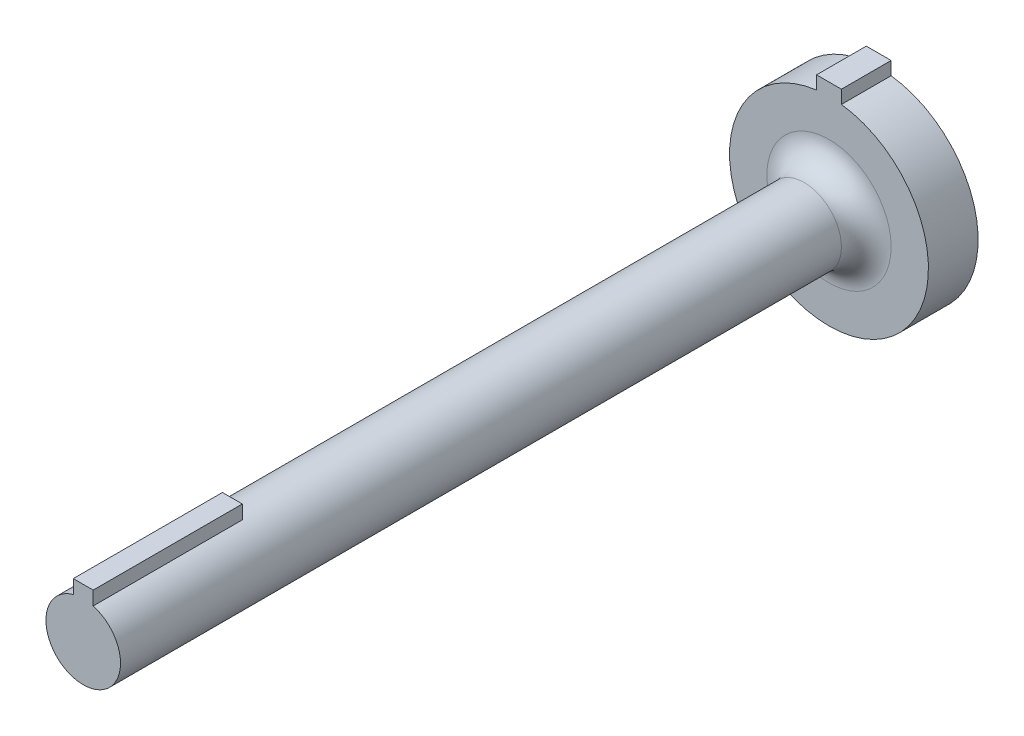
ISO-10303-21;
HEADER;
FILE_DESCRIPTION(('STEP AP214'),'2;1');
FILE_NAME('part.step','',(''),(''),'','','');
FILE_SCHEMA(('AUTOMOTIVE_DESIGN { 1 0 10303 214 1 1 1 1 }'));
ENDSEC;
DATA;
#1=APPLICATION_CONTEXT('core data for automotive mechanical design processes');
#2=APPLICATION_PROTOCOL_DEFINITION('international standard','automotive_design',2000,#1);
#3=PRODUCT_CONTEXT('',#1,'mechanical');
#4=PRODUCT('Part','Part','',(#3));
#5=PRODUCT_RELATED_PRODUCT_CATEGORY('part','',(#4));
#6=PRODUCT_DEFINITION_FORMATION('','',#4);
#7=PRODUCT_DEFINITION_CONTEXT('part definition',#1,'design');
#8=PRODUCT_DEFINITION('design','',#6,#7);
#9=PRODUCT_DEFINITION_SHAPE('','',#8);
#10=(LENGTH_UNIT() NAMED_UNIT(*) SI_UNIT(.MILLI.,.METRE.));
#11=(NAMED_UNIT(*) PLANE_ANGLE_UNIT() SI_UNIT($,.RADIAN.));
#12=(NAMED_UNIT(*) SI_UNIT($,.STERADIAN.) SOLID_ANGLE_UNIT());
#13=UNCERTAINTY_MEASURE_WITH_UNIT(LENGTH_MEASURE(1.E-05),#10,'distance_accuracy_value','');
#14=(GEOMETRIC_REPRESENTATION_CONTEXT(3) GLOBAL_UNCERTAINTY_ASSIGNED_CONTEXT((#13)) GLOBAL_UNIT_ASSIGNED_CONTEXT((#10,
#11,#12)) REPRESENTATION_CONTEXT('',''));
#15=CARTESIAN_POINT('',(0.,0.,0.));
#16=DIRECTION('',(0.,0.,1.));
#17=DIRECTION('',(1.,0.,0.));
#18=AXIS2_PLACEMENT_3D('',#15,#16,#17);
#19=CARTESIAN_POINT('',(0.,0.,1000.));
#20=DIRECTION('',(0.,0.,1.));
#21=DIRECTION('',(1.,0.,0.));
#22=AXIS2_PLACEMENT_3D('',#19,#20,#21);
#23=CYLINDRICAL_SURFACE('',#22,19.05);
#24=CARTESIAN_POINT('',(0.,0.,38.1));
#25=DIRECTION('',(0.,0.,1.));
#26=DIRECTION('',(1.,0.,0.));
#27=AXIS2_PLACEMENT_3D('',#24,#25,#26);
#28=CIRCLE('',#27,19.05);
#29=CARTESIAN_POINT('',(19.05,0.,38.1));
#30=VERTEX_POINT('',#29);
#31=EDGE_CURVE('E131',#30,#30,#28,.T.);
#32=ORIENTED_EDGE('',*,*,#31,.T.);
#33=EDGE_LOOP('',(#32));
#34=FACE_BOUND('',#33,.T.);
#35=DIRECTION('',(0.,0.,1.));
#36=VECTOR('',#35,1.);
#37=CARTESIAN_POINT('',(-5.08000000000001,18.3601770143972,1000.));
#38=LINE('',#37,#36);
#39=CARTESIAN_POINT('',(-5.08,18.3601770143972,330.2));
#40=VERTEX_POINT('',#39);
#41=CARTESIAN_POINT('',(-5.08,18.3601770143972,406.4));
#42=VERTEX_POINT('',#41);
#43=EDGE_CURVE('E11',#40,#42,#38,.T.);
#44=ORIENTED_EDGE('',*,*,#43,.F.);
#45=CARTESIAN_POINT('',(0.,0.,330.2));
#46=DIRECTION('',(0.,0.,1.));
#47=DIRECTION('',(1.,0.,0.));
#48=AXIS2_PLACEMENT_3D('',#45,#46,#47);
#49=CIRCLE('',#48,19.05);
#50=CARTESIAN_POINT('',(5.08,18.3601770143972,330.2));
#51=VERTEX_POINT('',#50);
#52=EDGE_CURVE('E49',#51,#40,#49,.T.);
#53=ORIENTED_EDGE('',*,*,#52,.F.);
#54=DIRECTION('',(0.,0.,1.));
#55=VECTOR('',#54,1.);
#56=CARTESIAN_POINT('',(5.08000000000001,18.3601770143972,1000.));
#57=LINE('',#56,#55);
#58=CARTESIAN_POINT('',(5.08000000000001,18.3601770143972,406.4));
#59=VERTEX_POINT('',#58);
#60=EDGE_CURVE('E42',#59,#51,#57,.F.);
#61=ORIENTED_EDGE('',*,*,#60,.F.);
#62=CARTESIAN_POINT('',(0.,0.,406.4));
#63=DIRECTION('',(0.,0.,1.));
#64=DIRECTION('',(1.,0.,0.));
#65=AXIS2_PLACEMENT_3D('',#62,#63,#64);
#66=CIRCLE('',#65,19.05);
#67=EDGE_CURVE('E54',#42,#59,#66,.T.);
#68=ORIENTED_EDGE('',*,*,#67,.F.);
#69=EDGE_LOOP('',(#44,#53,#61,#68));
#70=FACE_BOUND('',#69,.T.);
#71=ADVANCED_FACE('F34',(#34,#70),#23,.T.);
#72=CARTESIAN_POINT('',(-6.35,57.15,0.));
#73=DIRECTION('',(1.,0.,0.));
#74=DIRECTION('',(0.,0.,-1.));
#75=AXIS2_PLACEMENT_3D('',#72,#73,#74);
#76=PLANE('',#75);
#77=DIRECTION('',(0.,0.,1.));
#78=VECTOR('',#77,1.);
#79=CARTESIAN_POINT('',(-6.35,50.4015624757805,1000.));
#80=LINE('',#79,#78);
#81=CARTESIAN_POINT('',(-6.35,50.4015624757804,25.4));
#82=VERTEX_POINT('',#81);
#83=CARTESIAN_POINT('',(-6.35,50.4015624757804,0.));
#84=VERTEX_POINT('',#83);
#85=EDGE_CURVE('E137',#82,#84,#80,.F.);
#86=ORIENTED_EDGE('',*,*,#85,.F.);
#87=DIRECTION('',(0.,-1.,0.));
#88=VECTOR('',#87,1.);
#89=CARTESIAN_POINT('',(-6.35,57.15,25.4));
#90=LINE('',#89,#88);
#91=CARTESIAN_POINT('',(-6.35,57.15,25.4));
#92=VERTEX_POINT('',#91);
#93=EDGE_CURVE('E157',#92,#82,#90,.T.);
#94=ORIENTED_EDGE('',*,*,#93,.F.);
#95=DIRECTION('',(0.,0.,1.));
#96=VECTOR('',#95,1.);
#97=CARTESIAN_POINT('',(-6.35,57.15,0.));
#98=LINE('',#97,#96);
#99=CARTESIAN_POINT('',(-6.35,57.15,0.));
#100=VERTEX_POINT('',#99);
#101=EDGE_CURVE('E139',#100,#92,#98,.T.);
#102=ORIENTED_EDGE('',*,*,#101,.F.);
#103=DIRECTION('',(0.,-1.,0.));
#104=VECTOR('',#103,1.);
#105=CARTESIAN_POINT('',(-6.35,57.15,0.));
#106=LINE('',#105,#104);
#107=EDGE_CURVE('E148',#100,#84,#106,.T.);
#108=ORIENTED_EDGE('',*,*,#107,.T.);
#109=EDGE_LOOP('',(#86,#94,#102,#108));
#110=FACE_BOUND('',#109,.T.);
#111=ADVANCED_FACE('F36',(#110),#76,.F.);
#112=CARTESIAN_POINT('',(-6.35,57.15,25.4));
#113=DIRECTION('',(0.,0.,-1.));
#114=DIRECTION('',(-1.,0.,0.));
#115=AXIS2_PLACEMENT_3D('',#112,#113,#114);
#116=PLANE('',#115);
#117=ORIENTED_EDGE('',*,*,#93,.T.);
#118=CARTESIAN_POINT('',(0.,0.,25.4));
#119=DIRECTION('',(0.,0.,1.));
#120=DIRECTION('',(1.,0.,0.));
#121=AXIS2_PLACEMENT_3D('',#118,#119,#120);
#122=CIRCLE('',#121,50.8);
#123=CARTESIAN_POINT('',(6.35000000000014,50.4015624757804,25.4));
#124=VERTEX_POINT('',#123);
#125=EDGE_CURVE('E120',#82,#124,#122,.T.);
#126=ORIENTED_EDGE('',*,*,#125,.T.);
#127=DIRECTION('',(0.,-1.,0.));
#128=VECTOR('',#127,1.);
#129=CARTESIAN_POINT('',(6.35,57.15,25.4));
#130=LINE('',#129,#128);
#131=CARTESIAN_POINT('',(6.35,57.15,25.4));
#132=VERTEX_POINT('',#131);
#133=EDGE_CURVE('E154',#132,#124,#130,.T.);
#134=ORIENTED_EDGE('',*,*,#133,.F.);
#135=DIRECTION('',(1.,0.,0.));
#136=VECTOR('',#135,1.);
#137=CARTESIAN_POINT('',(-6.35,57.15,25.4));
#138=LINE('',#137,#136);
#139=EDGE_CURVE('E142',#92,#132,#138,.T.);
#140=ORIENTED_EDGE('',*,*,#139,.F.);
#141=EDGE_LOOP('',(#117,#126,#134,#140));
#142=FACE_BOUND('',#141,.T.);
#143=CARTESIAN_POINT('',(0.,0.,25.4));
#144=DIRECTION('',(0.,0.,1.));
#145=DIRECTION('',(1.,0.,0.));
#146=AXIS2_PLACEMENT_3D('',#143,#144,#145);
#147=CIRCLE('',#146,31.7500000000001);
#148=CARTESIAN_POINT('',(31.7500000000001,0.,25.4));
#149=VERTEX_POINT('',#148);
#150=EDGE_CURVE('E128',#149,#149,#147,.T.);
#151=ORIENTED_EDGE('',*,*,#150,.F.);
#152=EDGE_LOOP('',(#151));
#153=FACE_BOUND('',#152,.T.);
#154=ADVANCED_FACE('F184',(#142,#153),#116,.F.);
#155=CARTESIAN_POINT('',(6.35,57.15,0.));
#156=DIRECTION('',(-1.,0.,0.));
#157=DIRECTION('',(0.,0.,1.));
#158=AXIS2_PLACEMENT_3D('',#155,#156,#157);
#159=PLANE('',#158);
#160=DIRECTION('',(0.,0.,1.));
#161=VECTOR('',#160,1.);
#162=CARTESIAN_POINT('',(6.35000000000014,50.4015624757804,1000.));
#163=LINE('',#162,#161);
#164=CARTESIAN_POINT('',(6.35,50.4015624757804,0.));
#165=VERTEX_POINT('',#164);
#166=EDGE_CURVE('E135',#165,#124,#163,.T.);
#167=ORIENTED_EDGE('',*,*,#166,.F.);
#168=DIRECTION('',(0.,-1.,0.));
#169=VECTOR('',#168,1.);
#170=CARTESIAN_POINT('',(6.35,57.15,0.));
#171=LINE('',#170,#169);
#172=CARTESIAN_POINT('',(6.35,57.15,0.));
#173=VERTEX_POINT('',#172);
#174=EDGE_CURVE('E151',#173,#165,#171,.T.);
#175=ORIENTED_EDGE('',*,*,#174,.F.);
#176=DIRECTION('',(0.,0.,-1.));
#177=VECTOR('',#176,1.);
#178=CARTESIAN_POINT('',(6.35,57.15,0.));
#179=LINE('',#178,#177);
#180=EDGE_CURVE('E144',#132,#173,#179,.T.);
#181=ORIENTED_EDGE('',*,*,#180,.F.);
#182=ORIENTED_EDGE('',*,*,#133,.T.);
#183=EDGE_LOOP('',(#167,#175,#181,#182));
#184=FACE_BOUND('',#183,.T.);
#185=ADVANCED_FACE('F200',(#184),#159,.F.);
#186=CARTESIAN_POINT('',(-6.35,57.15,0.));
#187=DIRECTION('',(0.,0.,1.));
#188=DIRECTION('',(1.,0.,0.));
#189=AXIS2_PLACEMENT_3D('',#186,#187,#188);
#190=PLANE('',#189);
#191=ORIENTED_EDGE('',*,*,#174,.T.);
#192=CARTESIAN_POINT('',(0.,0.,0.));
#193=DIRECTION('',(0.,0.,1.));
#194=DIRECTION('',(1.,0.,0.));
#195=AXIS2_PLACEMENT_3D('',#192,#193,#194);
#196=CIRCLE('',#195,50.8);
#197=EDGE_CURVE('E118',#84,#165,#196,.T.);
#198=ORIENTED_EDGE('',*,*,#197,.F.);
#199=ORIENTED_EDGE('',*,*,#107,.F.);
#200=DIRECTION('',(-1.,0.,0.));
#201=VECTOR('',#200,1.);
#202=CARTESIAN_POINT('',(-6.35,57.15,0.));
#203=LINE('',#202,#201);
#204=EDGE_CURVE('E146',#173,#100,#203,.T.);
#205=ORIENTED_EDGE('',*,*,#204,.F.);
#206=EDGE_LOOP('',(#191,#198,#199,#205));
#207=FACE_BOUND('',#206,.T.);
#208=ADVANCED_FACE('F196',(#207),#190,.F.);
#209=CARTESIAN_POINT('',(0.,57.15,0.));
#210=DIRECTION('',(0.,1.,0.));
#211=DIRECTION('',(0.,0.,1.));
#212=AXIS2_PLACEMENT_3D('',#209,#210,#211);
#213=PLANE('',#212);
#214=ORIENTED_EDGE('',*,*,#101,.T.);
#215=ORIENTED_EDGE('',*,*,#139,.T.);
#216=ORIENTED_EDGE('',*,*,#180,.T.);
#217=ORIENTED_EDGE('',*,*,#204,.T.);
#218=EDGE_LOOP('',(#214,#215,#216,#217));
#219=FACE_BOUND('',#218,.T.);
#220=ADVANCED_FACE('F193',(#219),#213,.T.);
#221=CARTESIAN_POINT('',(0.,0.,1000.));
#222=DIRECTION('',(0.,0.,1.));
#223=DIRECTION('',(1.,0.,0.));
#224=AXIS2_PLACEMENT_3D('',#221,#222,#223);
#225=CYLINDRICAL_SURFACE('',#224,50.8);
#226=ORIENTED_EDGE('',*,*,#125,.F.);
#227=ORIENTED_EDGE('',*,*,#85,.T.);
#228=ORIENTED_EDGE('',*,*,#197,.T.);
#229=ORIENTED_EDGE('',*,*,#166,.T.);
#230=EDGE_LOOP('',(#226,#227,#228,#229));
#231=FACE_BOUND('',#230,.T.);
#232=ADVANCED_FACE('F192',(#231),#225,.T.);
#233=CARTESIAN_POINT('',(0.,19.05,406.4));
#234=DIRECTION('',(0.,0.,-1.));
#235=DIRECTION('',(-1.,0.,0.));
#236=AXIS2_PLACEMENT_3D('',#233,#234,#235);
#237=PLANE('',#236);
#238=ORIENTED_EDGE('',*,*,#67,.T.);
#239=DIRECTION('',(0.,-1.,0.));
#240=VECTOR('',#239,1.);
#241=CARTESIAN_POINT('',(5.08,25.4,406.4));
#242=LINE('',#241,#240);
#243=CARTESIAN_POINT('',(5.08,25.4,406.4));
#244=VERTEX_POINT('',#243);
#245=EDGE_CURVE('E103',#244,#59,#242,.T.);
#246=ORIENTED_EDGE('',*,*,#245,.F.);
#247=DIRECTION('',(1.,0.,0.));
#248=VECTOR('',#247,1.);
#249=CARTESIAN_POINT('',(-5.08,25.4,406.4));
#250=LINE('',#249,#248);
#251=CARTESIAN_POINT('',(-5.08,25.4,406.4));
#252=VERTEX_POINT('',#251);
#253=EDGE_CURVE('E97',#252,#244,#250,.T.);
#254=ORIENTED_EDGE('',*,*,#253,.F.);
#255=DIRECTION('',(0.,-1.,0.));
#256=VECTOR('',#255,1.);
#257=CARTESIAN_POINT('',(-5.08,25.4,406.4));
#258=LINE('',#257,#256);
#259=EDGE_CURVE('E101',#252,#42,#258,.T.);
#260=ORIENTED_EDGE('',*,*,#259,.T.);
#261=EDGE_LOOP('',(#238,#246,#254,#260));
#262=FACE_BOUND('',#261,.T.);
#263=ADVANCED_FACE('F99',(#262),#237,.F.);
#264=CARTESIAN_POINT('',(0.,0.,38.1));
#265=DIRECTION('',(0.,0.,1.));
#266=DIRECTION('',(1.,0.,0.));
#267=AXIS2_PLACEMENT_3D('',#264,#265,#266);
#268=TOROIDAL_SURFACE('',#267,31.75,12.7);
#269=ORIENTED_EDGE('',*,*,#31,.F.);
#270=EDGE_LOOP('',(#269));
#271=FACE_BOUND('',#270,.T.);
#272=ORIENTED_EDGE('',*,*,#150,.T.);
#273=EDGE_LOOP('',(#272));
#274=FACE_BOUND('',#273,.T.);
#275=ADVANCED_FACE('F188',(#271,#274),#268,.F.);
#276=CARTESIAN_POINT('',(-5.08,25.4,406.4));
#277=DIRECTION('',(1.,0.,0.));
#278=DIRECTION('',(0.,0.,-1.));
#279=AXIS2_PLACEMENT_3D('',#276,#277,#278);
#280=PLANE('',#279);
#281=DIRECTION('',(0.,-1.,0.));
#282=VECTOR('',#281,1.);
#283=CARTESIAN_POINT('',(-5.08,25.4,330.2));
#284=LINE('',#283,#282);
#285=CARTESIAN_POINT('',(-5.08,25.4,330.2));
#286=VERTEX_POINT('',#285);
#287=EDGE_CURVE('E166',#286,#40,#284,.T.);
#288=ORIENTED_EDGE('',*,*,#287,.T.);
#289=ORIENTED_EDGE('',*,*,#43,.T.);
#290=ORIENTED_EDGE('',*,*,#259,.F.);
#291=DIRECTION('',(0.,0.,1.));
#292=VECTOR('',#291,1.);
#293=CARTESIAN_POINT('',(-5.08,25.4,406.4));
#294=LINE('',#293,#292);
#295=EDGE_CURVE('E107',#286,#252,#294,.T.);
#296=ORIENTED_EDGE('',*,*,#295,.F.);
#297=EDGE_LOOP('',(#288,#289,#290,#296));
#298=FACE_BOUND('',#297,.T.);
#299=ADVANCED_FACE('F117',(#298),#280,.F.);
#300=CARTESIAN_POINT('',(5.08,25.4,406.4));
#301=DIRECTION('',(-1.,0.,0.));
#302=DIRECTION('',(0.,0.,1.));
#303=AXIS2_PLACEMENT_3D('',#300,#301,#302);
#304=PLANE('',#303);
#305=ORIENTED_EDGE('',*,*,#245,.T.);
#306=ORIENTED_EDGE('',*,*,#60,.T.);
#307=DIRECTION('',(0.,-1.,0.));
#308=VECTOR('',#307,1.);
#309=CARTESIAN_POINT('',(5.08,25.4,330.2));
#310=LINE('',#309,#308);
#311=CARTESIAN_POINT('',(5.08,25.4,330.2));
#312=VERTEX_POINT('',#311);
#313=EDGE_CURVE('E122',#312,#51,#310,.T.);
#314=ORIENTED_EDGE('',*,*,#313,.F.);
#315=DIRECTION('',(0.,0.,-1.));
#316=VECTOR('',#315,1.);
#317=CARTESIAN_POINT('',(5.08,25.4,406.4));
#318=LINE('',#317,#316);
#319=EDGE_CURVE('E106',#244,#312,#318,.T.);
#320=ORIENTED_EDGE('',*,*,#319,.F.);
#321=EDGE_LOOP('',(#305,#306,#314,#320));
#322=FACE_BOUND('',#321,.T.);
#323=ADVANCED_FACE('F163',(#322),#304,.F.);
#324=CARTESIAN_POINT('',(-5.08,25.4,330.2));
#325=DIRECTION('',(0.,0.,1.));
#326=DIRECTION('',(1.,0.,0.));
#327=AXIS2_PLACEMENT_3D('',#324,#325,#326);
#328=PLANE('',#327);
#329=ORIENTED_EDGE('',*,*,#313,.T.);
#330=ORIENTED_EDGE('',*,*,#52,.T.);
#331=ORIENTED_EDGE('',*,*,#287,.F.);
#332=DIRECTION('',(-1.,0.,0.));
#333=VECTOR('',#332,1.);
#334=CARTESIAN_POINT('',(-5.08,25.4,330.2));
#335=LINE('',#334,#333);
#336=EDGE_CURVE('E112',#312,#286,#335,.T.);
#337=ORIENTED_EDGE('',*,*,#336,.F.);
#338=EDGE_LOOP('',(#329,#330,#331,#337));
#339=FACE_BOUND('',#338,.T.);
#340=ADVANCED_FACE('F165',(#339),#328,.F.);
#341=CARTESIAN_POINT('',(0.,25.4,0.));
#342=DIRECTION('',(0.,-1.,0.));
#343=DIRECTION('',(0.,0.,-1.));
#344=AXIS2_PLACEMENT_3D('',#341,#342,#343);
#345=PLANE('',#344);
#346=ORIENTED_EDGE('',*,*,#295,.T.);
#347=ORIENTED_EDGE('',*,*,#253,.T.);
#348=ORIENTED_EDGE('',*,*,#319,.T.);
#349=ORIENTED_EDGE('',*,*,#336,.T.);
#350=EDGE_LOOP('',(#346,#347,#348,#349));
#351=FACE_BOUND('',#350,.T.);
#352=ADVANCED_FACE('F110',(#351),#345,.F.);
#353=CLOSED_SHELL('',(#71,#111,#154,#185,#208,#220,#232,#263,#275,#299,#323,#340,#352));
#354=MANIFOLD_SOLID_BREP('B2',#353);
#355=ADVANCED_BREP_SHAPE_REPRESENTATION('',(#18,#354),#14);
#356=SHAPE_DEFINITION_REPRESENTATION(#9,#355);
ENDSEC;
END-ISO-10303-21;
